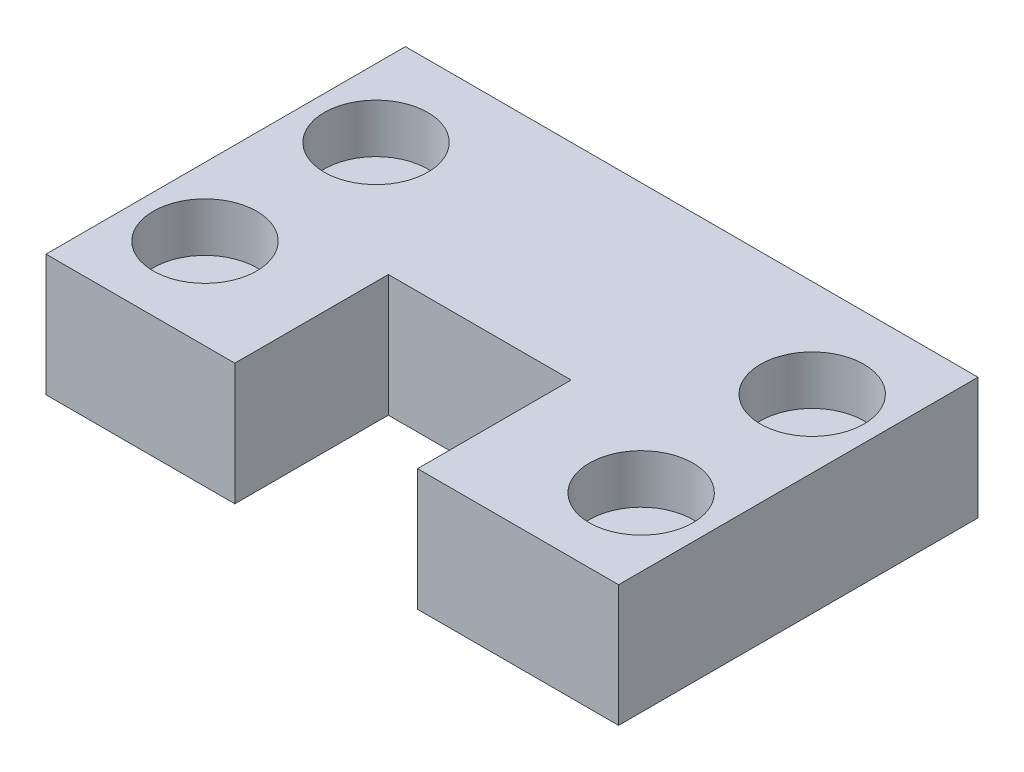
ISO-10303-21;
HEADER;
FILE_DESCRIPTION(('STEP AP214'),'2;1');
FILE_NAME('part.step','',(''),(''),'','','');
FILE_SCHEMA(('AUTOMOTIVE_DESIGN { 1 0 10303 214 1 1 1 1 }'));
ENDSEC;
DATA;
#1=APPLICATION_CONTEXT('core data for automotive mechanical design processes');
#2=APPLICATION_PROTOCOL_DEFINITION('international standard','automotive_design',2000,#1);
#3=PRODUCT_CONTEXT('',#1,'mechanical');
#4=PRODUCT('Part','Part','',(#3));
#5=PRODUCT_RELATED_PRODUCT_CATEGORY('part','',(#4));
#6=PRODUCT_DEFINITION_FORMATION('','',#4);
#7=PRODUCT_DEFINITION_CONTEXT('part definition',#1,'design');
#8=PRODUCT_DEFINITION('design','',#6,#7);
#9=PRODUCT_DEFINITION_SHAPE('','',#8);
#10=(LENGTH_UNIT() NAMED_UNIT(*) SI_UNIT(.MILLI.,.METRE.));
#11=(NAMED_UNIT(*) PLANE_ANGLE_UNIT() SI_UNIT($,.RADIAN.));
#12=(NAMED_UNIT(*) SI_UNIT($,.STERADIAN.) SOLID_ANGLE_UNIT());
#13=UNCERTAINTY_MEASURE_WITH_UNIT(LENGTH_MEASURE(1.E-05),#10,'distance_accuracy_value','');
#14=(GEOMETRIC_REPRESENTATION_CONTEXT(3) GLOBAL_UNCERTAINTY_ASSIGNED_CONTEXT((#13)) GLOBAL_UNIT_ASSIGNED_CONTEXT((#10,
#11,#12)) REPRESENTATION_CONTEXT('',''));
#15=CARTESIAN_POINT('',(0.,0.,0.));
#16=DIRECTION('',(0.,0.,1.));
#17=DIRECTION('',(1.,0.,0.));
#18=AXIS2_PLACEMENT_3D('',#15,#16,#17);
#19=CARTESIAN_POINT('',(30.5,10.,-12.6));
#20=DIRECTION('',(0.,0.,1.));
#21=DIRECTION('',(1.,0.,0.));
#22=AXIS2_PLACEMENT_3D('',#19,#20,#21);
#23=PLANE('',#22);
#24=DIRECTION('',(-1.,0.,0.));
#25=VECTOR('',#24,1.);
#26=CARTESIAN_POINT('',(30.5,0.,-12.6));
#27=LINE('',#26,#25);
#28=CARTESIAN_POINT('',(30.5,0.,-12.6));
#29=VERTEX_POINT('',#28);
#30=CARTESIAN_POINT('',(15.5,0.,-12.6));
#31=VERTEX_POINT('',#30);
#32=EDGE_CURVE('E131',#29,#31,#27,.T.);
#33=ORIENTED_EDGE('',*,*,#32,.F.);
#34=DIRECTION('',(0.,-1.,0.));
#35=VECTOR('',#34,1.);
#36=CARTESIAN_POINT('',(30.5,10.,-12.6));
#37=LINE('',#36,#35);
#38=CARTESIAN_POINT('',(30.5,10.,-12.6));
#39=VERTEX_POINT('',#38);
#40=EDGE_CURVE('E11',#39,#29,#37,.T.);
#41=ORIENTED_EDGE('',*,*,#40,.F.);
#42=DIRECTION('',(-1.,0.,0.));
#43=VECTOR('',#42,1.);
#44=CARTESIAN_POINT('',(30.5,10.,-12.6));
#45=LINE('',#44,#43);
#46=CARTESIAN_POINT('',(15.5,10.,-12.6));
#47=VERTEX_POINT('',#46);
#48=EDGE_CURVE('E151',#39,#47,#45,.T.);
#49=ORIENTED_EDGE('',*,*,#48,.T.);
#50=DIRECTION('',(0.,-1.,0.));
#51=VECTOR('',#50,1.);
#52=CARTESIAN_POINT('',(15.5,10.,-12.6));
#53=LINE('',#52,#51);
#54=EDGE_CURVE('E36',#47,#31,#53,.T.);
#55=ORIENTED_EDGE('',*,*,#54,.T.);
#56=EDGE_LOOP('',(#33,#41,#49,#55));
#57=FACE_BOUND('',#56,.T.);
#58=ADVANCED_FACE('F33',(#57),#23,.T.);
#59=CARTESIAN_POINT('',(30.5,10.,-12.6));
#60=DIRECTION('',(1.,0.,0.));
#61=DIRECTION('',(0.,0.,-1.));
#62=AXIS2_PLACEMENT_3D('',#59,#60,#61);
#63=PLANE('',#62);
#64=DIRECTION('',(0.,0.,1.));
#65=VECTOR('',#64,1.);
#66=CARTESIAN_POINT('',(30.5,0.,-12.6));
#67=LINE('',#66,#65);
#68=CARTESIAN_POINT('',(30.5,0.,0.));
#69=VERTEX_POINT('',#68);
#70=EDGE_CURVE('E150',#29,#69,#67,.T.);
#71=ORIENTED_EDGE('',*,*,#70,.T.);
#72=DIRECTION('',(0.,-1.,0.));
#73=VECTOR('',#72,1.);
#74=CARTESIAN_POINT('',(30.5,10.,0.));
#75=LINE('',#74,#73);
#76=CARTESIAN_POINT('',(30.5,10.,0.));
#77=VERTEX_POINT('',#76);
#78=EDGE_CURVE('E42',#77,#69,#75,.T.);
#79=ORIENTED_EDGE('',*,*,#78,.F.);
#80=DIRECTION('',(0.,0.,1.));
#81=VECTOR('',#80,1.);
#82=CARTESIAN_POINT('',(30.5,10.,-12.6));
#83=LINE('',#82,#81);
#84=EDGE_CURVE('E121',#39,#77,#83,.T.);
#85=ORIENTED_EDGE('',*,*,#84,.F.);
#86=ORIENTED_EDGE('',*,*,#40,.T.);
#87=EDGE_LOOP('',(#71,#79,#85,#86));
#88=FACE_BOUND('',#87,.T.);
#89=ADVANCED_FACE('F163',(#88),#63,.F.);
#90=CARTESIAN_POINT('',(47.,10.,0.));
#91=DIRECTION('',(0.,0.,1.));
#92=DIRECTION('',(1.,0.,0.));
#93=AXIS2_PLACEMENT_3D('',#90,#91,#92);
#94=PLANE('',#93);
#95=DIRECTION('',(-1.,0.,0.));
#96=VECTOR('',#95,1.);
#97=CARTESIAN_POINT('',(47.,0.,0.));
#98=LINE('',#97,#96);
#99=CARTESIAN_POINT('',(47.,0.,0.));
#100=VERTEX_POINT('',#99);
#101=EDGE_CURVE('E107',#100,#69,#98,.T.);
#102=ORIENTED_EDGE('',*,*,#101,.F.);
#103=DIRECTION('',(0.,-1.,0.));
#104=VECTOR('',#103,1.);
#105=CARTESIAN_POINT('',(47.,10.,0.));
#106=LINE('',#105,#104);
#107=CARTESIAN_POINT('',(47.,10.,0.));
#108=VERTEX_POINT('',#107);
#109=EDGE_CURVE('E102',#108,#100,#106,.T.);
#110=ORIENTED_EDGE('',*,*,#109,.F.);
#111=DIRECTION('',(-1.,0.,0.));
#112=VECTOR('',#111,1.);
#113=CARTESIAN_POINT('',(47.,10.,0.));
#114=LINE('',#113,#112);
#115=EDGE_CURVE('E105',#108,#77,#114,.T.);
#116=ORIENTED_EDGE('',*,*,#115,.T.);
#117=ORIENTED_EDGE('',*,*,#78,.T.);
#118=EDGE_LOOP('',(#102,#110,#116,#117));
#119=FACE_BOUND('',#118,.T.);
#120=ADVANCED_FACE('F104',(#119),#94,.T.);
#121=CARTESIAN_POINT('',(47.,10.,-29.5));
#122=DIRECTION('',(1.,0.,0.));
#123=DIRECTION('',(0.,0.,-1.));
#124=AXIS2_PLACEMENT_3D('',#121,#122,#123);
#125=PLANE('',#124);
#126=DIRECTION('',(0.,0.,1.));
#127=VECTOR('',#126,1.);
#128=CARTESIAN_POINT('',(47.,0.,-29.5));
#129=LINE('',#128,#127);
#130=CARTESIAN_POINT('',(47.,0.,-29.5));
#131=VERTEX_POINT('',#130);
#132=EDGE_CURVE('E147',#131,#100,#129,.T.);
#133=ORIENTED_EDGE('',*,*,#132,.F.);
#134=DIRECTION('',(0.,-1.,0.));
#135=VECTOR('',#134,1.);
#136=CARTESIAN_POINT('',(47.,10.,-29.5));
#137=LINE('',#136,#135);
#138=CARTESIAN_POINT('',(47.,10.,-29.5));
#139=VERTEX_POINT('',#138);
#140=EDGE_CURVE('E112',#139,#131,#137,.T.);
#141=ORIENTED_EDGE('',*,*,#140,.F.);
#142=DIRECTION('',(0.,0.,1.));
#143=VECTOR('',#142,1.);
#144=CARTESIAN_POINT('',(47.,10.,-29.5));
#145=LINE('',#144,#143);
#146=EDGE_CURVE('E119',#139,#108,#145,.T.);
#147=ORIENTED_EDGE('',*,*,#146,.T.);
#148=ORIENTED_EDGE('',*,*,#109,.T.);
#149=EDGE_LOOP('',(#133,#141,#147,#148));
#150=FACE_BOUND('',#149,.T.);
#151=ADVANCED_FACE('F123',(#150),#125,.T.);
#152=CARTESIAN_POINT('',(0.,10.,-29.5));
#153=DIRECTION('',(0.,0.,-1.));
#154=DIRECTION('',(-1.,0.,0.));
#155=AXIS2_PLACEMENT_3D('',#152,#153,#154);
#156=PLANE('',#155);
#157=DIRECTION('',(1.,0.,0.));
#158=VECTOR('',#157,1.);
#159=CARTESIAN_POINT('',(0.,0.,-29.5));
#160=LINE('',#159,#158);
#161=CARTESIAN_POINT('',(0.,0.,-29.5));
#162=VERTEX_POINT('',#161);
#163=EDGE_CURVE('E144',#162,#131,#160,.T.);
#164=ORIENTED_EDGE('',*,*,#163,.F.);
#165=DIRECTION('',(0.,-1.,0.));
#166=VECTOR('',#165,1.);
#167=CARTESIAN_POINT('',(0.,10.,-29.5));
#168=LINE('',#167,#166);
#169=CARTESIAN_POINT('',(0.,10.,-29.5));
#170=VERTEX_POINT('',#169);
#171=EDGE_CURVE('E155',#170,#162,#168,.T.);
#172=ORIENTED_EDGE('',*,*,#171,.F.);
#173=DIRECTION('',(1.,0.,0.));
#174=VECTOR('',#173,1.);
#175=CARTESIAN_POINT('',(0.,10.,-29.5));
#176=LINE('',#175,#174);
#177=EDGE_CURVE('E124',#170,#139,#176,.T.);
#178=ORIENTED_EDGE('',*,*,#177,.T.);
#179=ORIENTED_EDGE('',*,*,#140,.T.);
#180=EDGE_LOOP('',(#164,#172,#178,#179));
#181=FACE_BOUND('',#180,.T.);
#182=ADVANCED_FACE('F183',(#181),#156,.T.);
#183=CARTESIAN_POINT('',(0.,10.,0.));
#184=DIRECTION('',(-1.,0.,0.));
#185=DIRECTION('',(0.,0.,1.));
#186=AXIS2_PLACEMENT_3D('',#183,#184,#185);
#187=PLANE('',#186);
#188=DIRECTION('',(0.,0.,-1.));
#189=VECTOR('',#188,1.);
#190=CARTESIAN_POINT('',(0.,0.,0.));
#191=LINE('',#190,#189);
#192=CARTESIAN_POINT('',(0.,0.,0.));
#193=VERTEX_POINT('',#192);
#194=EDGE_CURVE('E141',#193,#162,#191,.T.);
#195=ORIENTED_EDGE('',*,*,#194,.F.);
#196=DIRECTION('',(0.,-1.,0.));
#197=VECTOR('',#196,1.);
#198=CARTESIAN_POINT('',(0.,10.,0.));
#199=LINE('',#198,#197);
#200=CARTESIAN_POINT('',(0.,10.,0.));
#201=VERTEX_POINT('',#200);
#202=EDGE_CURVE('E157',#201,#193,#199,.T.);
#203=ORIENTED_EDGE('',*,*,#202,.F.);
#204=DIRECTION('',(0.,0.,-1.));
#205=VECTOR('',#204,1.);
#206=CARTESIAN_POINT('',(0.,10.,0.));
#207=LINE('',#206,#205);
#208=EDGE_CURVE('E126',#201,#170,#207,.T.);
#209=ORIENTED_EDGE('',*,*,#208,.T.);
#210=ORIENTED_EDGE('',*,*,#171,.T.);
#211=EDGE_LOOP('',(#195,#203,#209,#210));
#212=FACE_BOUND('',#211,.T.);
#213=ADVANCED_FACE('F178',(#212),#187,.T.);
#214=CARTESIAN_POINT('',(15.5,10.,0.));
#215=DIRECTION('',(0.,0.,1.));
#216=DIRECTION('',(1.,0.,0.));
#217=AXIS2_PLACEMENT_3D('',#214,#215,#216);
#218=PLANE('',#217);
#219=DIRECTION('',(-1.,0.,0.));
#220=VECTOR('',#219,1.);
#221=CARTESIAN_POINT('',(15.5,0.,0.));
#222=LINE('',#221,#220);
#223=CARTESIAN_POINT('',(15.5,0.,0.));
#224=VERTEX_POINT('',#223);
#225=EDGE_CURVE('E138',#224,#193,#222,.T.);
#226=ORIENTED_EDGE('',*,*,#225,.F.);
#227=DIRECTION('',(0.,-1.,0.));
#228=VECTOR('',#227,1.);
#229=CARTESIAN_POINT('',(15.5,10.,0.));
#230=LINE('',#229,#228);
#231=CARTESIAN_POINT('',(15.5,10.,0.));
#232=VERTEX_POINT('',#231);
#233=EDGE_CURVE('E158',#232,#224,#230,.T.);
#234=ORIENTED_EDGE('',*,*,#233,.F.);
#235=DIRECTION('',(-1.,0.,0.));
#236=VECTOR('',#235,1.);
#237=CARTESIAN_POINT('',(15.5,10.,0.));
#238=LINE('',#237,#236);
#239=EDGE_CURVE('E167',#232,#201,#238,.T.);
#240=ORIENTED_EDGE('',*,*,#239,.T.);
#241=ORIENTED_EDGE('',*,*,#202,.T.);
#242=EDGE_LOOP('',(#226,#234,#240,#241));
#243=FACE_BOUND('',#242,.T.);
#244=ADVANCED_FACE('F181',(#243),#218,.T.);
#245=CARTESIAN_POINT('',(15.5,10.,-12.6));
#246=DIRECTION('',(1.,0.,0.));
#247=DIRECTION('',(0.,0.,-1.));
#248=AXIS2_PLACEMENT_3D('',#245,#246,#247);
#249=PLANE('',#248);
#250=DIRECTION('',(0.,0.,1.));
#251=VECTOR('',#250,1.);
#252=CARTESIAN_POINT('',(15.5,0.,-12.6));
#253=LINE('',#252,#251);
#254=EDGE_CURVE('E134',#31,#224,#253,.T.);
#255=ORIENTED_EDGE('',*,*,#254,.F.);
#256=ORIENTED_EDGE('',*,*,#54,.F.);
#257=DIRECTION('',(0.,0.,1.));
#258=VECTOR('',#257,1.);
#259=CARTESIAN_POINT('',(15.5,10.,-12.6));
#260=LINE('',#259,#258);
#261=EDGE_CURVE('E165',#47,#232,#260,.T.);
#262=ORIENTED_EDGE('',*,*,#261,.T.);
#263=ORIENTED_EDGE('',*,*,#233,.T.);
#264=EDGE_LOOP('',(#255,#256,#262,#263));
#265=FACE_BOUND('',#264,.T.);
#266=ADVANCED_FACE('F160',(#265),#249,.T.);
#267=CARTESIAN_POINT('',(0.,10.,0.));
#268=DIRECTION('',(0.,1.,0.));
#269=DIRECTION('',(0.,0.,1.));
#270=AXIS2_PLACEMENT_3D('',#267,#268,#269);
#271=PLANE('',#270);
#272=CARTESIAN_POINT('',(41.4,10.,-7.45));
#273=DIRECTION('',(0.,1.,0.));
#274=DIRECTION('',(0.,0.,1.));
#275=AXIS2_PLACEMENT_3D('',#272,#273,#274);
#276=CIRCLE('',#275,4.25000000000001);
#277=CARTESIAN_POINT('',(41.4,10.,-3.19999999999999));
#278=VERTEX_POINT('',#277);
#279=EDGE_CURVE('E295',#278,#278,#276,.T.);
#280=ORIENTED_EDGE('',*,*,#279,.F.);
#281=EDGE_LOOP('',(#280));
#282=FACE_BOUND('',#281,.T.);
#283=CARTESIAN_POINT('',(5.60000000000001,10.,-21.49));
#284=DIRECTION('',(0.,1.,0.));
#285=DIRECTION('',(0.,0.,1.));
#286=AXIS2_PLACEMENT_3D('',#283,#284,#285);
#287=CIRCLE('',#286,4.25);
#288=CARTESIAN_POINT('',(5.60000000000001,10.,-17.24));
#289=VERTEX_POINT('',#288);
#290=EDGE_CURVE('E289',#289,#289,#287,.T.);
#291=ORIENTED_EDGE('',*,*,#290,.F.);
#292=EDGE_LOOP('',(#291));
#293=FACE_BOUND('',#292,.T.);
#294=CARTESIAN_POINT('',(41.4,10.,-21.49));
#295=DIRECTION('',(0.,1.,0.));
#296=DIRECTION('',(0.,0.,-1.));
#297=AXIS2_PLACEMENT_3D('',#294,#295,#296);
#298=CIRCLE('',#297,4.25);
#299=CARTESIAN_POINT('',(41.4,10.,-25.74));
#300=VERTEX_POINT('',#299);
#301=EDGE_CURVE('E283',#300,#300,#298,.T.);
#302=ORIENTED_EDGE('',*,*,#301,.F.);
#303=EDGE_LOOP('',(#302));
#304=FACE_BOUND('',#303,.T.);
#305=CARTESIAN_POINT('',(5.60000000000001,10.,-7.45));
#306=DIRECTION('',(0.,1.,0.));
#307=DIRECTION('',(0.,0.,-1.));
#308=AXIS2_PLACEMENT_3D('',#305,#306,#307);
#309=CIRCLE('',#308,4.25000000000001);
#310=CARTESIAN_POINT('',(5.60000000000001,10.,-11.7));
#311=VERTEX_POINT('',#310);
#312=EDGE_CURVE('E170',#311,#311,#309,.T.);
#313=ORIENTED_EDGE('',*,*,#312,.F.);
#314=EDGE_LOOP('',(#313));
#315=FACE_BOUND('',#314,.T.);
#316=ORIENTED_EDGE('',*,*,#48,.F.);
#317=ORIENTED_EDGE('',*,*,#84,.T.);
#318=ORIENTED_EDGE('',*,*,#115,.F.);
#319=ORIENTED_EDGE('',*,*,#146,.F.);
#320=ORIENTED_EDGE('',*,*,#177,.F.);
#321=ORIENTED_EDGE('',*,*,#208,.F.);
#322=ORIENTED_EDGE('',*,*,#239,.F.);
#323=ORIENTED_EDGE('',*,*,#261,.F.);
#324=EDGE_LOOP('',(#316,#317,#318,#319,#320,#321,#322,#323));
#325=FACE_BOUND('',#324,.T.);
#326=ADVANCED_FACE('F117',(#282,#293,#304,#315,#325),#271,.T.);
#327=CARTESIAN_POINT('',(0.,0.,0.));
#328=DIRECTION('',(0.,1.,0.));
#329=DIRECTION('',(0.,0.,1.));
#330=AXIS2_PLACEMENT_3D('',#327,#328,#329);
#331=PLANE('',#330);
#332=CARTESIAN_POINT('',(41.4,0.,-7.45));
#333=DIRECTION('',(0.,1.,0.));
#334=DIRECTION('',(0.,0.,-1.));
#335=AXIS2_PLACEMENT_3D('',#332,#333,#334);
#336=CIRCLE('',#335,1.3);
#337=CARTESIAN_POINT('',(41.4,0.,-6.15));
#338=VERTEX_POINT('',#337);
#339=EDGE_CURVE('E268',#338,#338,#336,.T.);
#340=ORIENTED_EDGE('',*,*,#339,.T.);
#341=EDGE_LOOP('',(#340));
#342=FACE_BOUND('',#341,.T.);
#343=CARTESIAN_POINT('',(5.60000000000001,0.,-21.49));
#344=DIRECTION('',(0.,1.,0.));
#345=DIRECTION('',(0.,0.,1.));
#346=AXIS2_PLACEMENT_3D('',#343,#344,#345);
#347=CIRCLE('',#346,1.3);
#348=CARTESIAN_POINT('',(5.60000000000001,0.,-20.19));
#349=VERTEX_POINT('',#348);
#350=EDGE_CURVE('E275',#349,#349,#347,.T.);
#351=ORIENTED_EDGE('',*,*,#350,.T.);
#352=EDGE_LOOP('',(#351));
#353=FACE_BOUND('',#352,.T.);
#354=CARTESIAN_POINT('',(41.4,0.,-21.49));
#355=DIRECTION('',(0.,1.,0.));
#356=DIRECTION('',(0.,0.,1.));
#357=AXIS2_PLACEMENT_3D('',#354,#355,#356);
#358=CIRCLE('',#357,1.3);
#359=CARTESIAN_POINT('',(41.4,0.,-20.19));
#360=VERTEX_POINT('',#359);
#361=EDGE_CURVE('E260',#360,#360,#358,.T.);
#362=ORIENTED_EDGE('',*,*,#361,.T.);
#363=EDGE_LOOP('',(#362));
#364=FACE_BOUND('',#363,.T.);
#365=CARTESIAN_POINT('',(5.60000000000001,0.,-7.45));
#366=DIRECTION('',(0.,1.,0.));
#367=DIRECTION('',(0.,0.,1.));
#368=AXIS2_PLACEMENT_3D('',#365,#366,#367);
#369=CIRCLE('',#368,1.3);
#370=CARTESIAN_POINT('',(5.60000000000001,0.,-6.15));
#371=VERTEX_POINT('',#370);
#372=EDGE_CURVE('E280',#371,#371,#369,.T.);
#373=ORIENTED_EDGE('',*,*,#372,.T.);
#374=EDGE_LOOP('',(#373));
#375=FACE_BOUND('',#374,.T.);
#376=ORIENTED_EDGE('',*,*,#32,.T.);
#377=ORIENTED_EDGE('',*,*,#254,.T.);
#378=ORIENTED_EDGE('',*,*,#225,.T.);
#379=ORIENTED_EDGE('',*,*,#194,.T.);
#380=ORIENTED_EDGE('',*,*,#163,.T.);
#381=ORIENTED_EDGE('',*,*,#132,.T.);
#382=ORIENTED_EDGE('',*,*,#101,.T.);
#383=ORIENTED_EDGE('',*,*,#70,.F.);
#384=EDGE_LOOP('',(#376,#377,#378,#379,#380,#381,#382,#383));
#385=FACE_BOUND('',#384,.T.);
#386=ADVANCED_FACE('F162',(#342,#353,#364,#375,#385),#331,.F.);
#387=CARTESIAN_POINT('',(5.60000000000001,5.98,-7.45));
#388=DIRECTION('',(0.,1.,0.));
#389=DIRECTION('',(0.,0.,1.));
#390=AXIS2_PLACEMENT_3D('',#387,#388,#389);
#391=CYLINDRICAL_SURFACE('',#390,4.25000000000001);
#392=CARTESIAN_POINT('',(5.60000000000001,5.98,-7.45));
#393=DIRECTION('',(0.,1.,0.));
#394=DIRECTION('',(0.,0.,-1.));
#395=AXIS2_PLACEMENT_3D('',#392,#393,#394);
#396=CIRCLE('',#395,4.25000000000001);
#397=CARTESIAN_POINT('',(5.60000000000001,5.98,-11.7));
#398=VERTEX_POINT('',#397);
#399=EDGE_CURVE('E135',#398,#398,#396,.T.);
#400=ORIENTED_EDGE('',*,*,#399,.F.);
#401=EDGE_LOOP('',(#400));
#402=FACE_BOUND('',#401,.T.);
#403=ORIENTED_EDGE('',*,*,#312,.T.);
#404=EDGE_LOOP('',(#403));
#405=FACE_BOUND('',#404,.T.);
#406=ADVANCED_FACE('F204',(#402,#405),#391,.F.);
#407=CARTESIAN_POINT('',(5.60000000000001,5.98,-7.45));
#408=DIRECTION('',(0.,-1.,0.));
#409=DIRECTION('',(0.,0.,-1.));
#410=AXIS2_PLACEMENT_3D('',#407,#408,#409);
#411=PLANE('',#410);
#412=CARTESIAN_POINT('',(5.60000000000001,5.98,-7.45));
#413=DIRECTION('',(0.,1.,0.));
#414=DIRECTION('',(0.,0.,1.));
#415=AXIS2_PLACEMENT_3D('',#412,#413,#414);
#416=CIRCLE('',#415,1.3);
#417=CARTESIAN_POINT('',(5.60000000000001,5.98,-6.15));
#418=VERTEX_POINT('',#417);
#419=EDGE_CURVE('E271',#418,#418,#416,.T.);
#420=ORIENTED_EDGE('',*,*,#419,.F.);
#421=EDGE_LOOP('',(#420));
#422=FACE_BOUND('',#421,.T.);
#423=ORIENTED_EDGE('',*,*,#399,.T.);
#424=EDGE_LOOP('',(#423));
#425=FACE_BOUND('',#424,.T.);
#426=ADVANCED_FACE('F211',(#422,#425),#411,.F.);
#427=CARTESIAN_POINT('',(41.4,5.98,-21.49));
#428=DIRECTION('',(0.,1.,0.));
#429=DIRECTION('',(0.,0.,1.));
#430=AXIS2_PLACEMENT_3D('',#427,#428,#429);
#431=CYLINDRICAL_SURFACE('',#430,4.25);
#432=CARTESIAN_POINT('',(41.4,5.98,-21.49));
#433=DIRECTION('',(0.,1.,0.));
#434=DIRECTION('',(0.,0.,-1.));
#435=AXIS2_PLACEMENT_3D('',#432,#433,#434);
#436=CIRCLE('',#435,4.25);
#437=CARTESIAN_POINT('',(41.4,5.98,-25.74));
#438=VERTEX_POINT('',#437);
#439=EDGE_CURVE('E286',#438,#438,#436,.T.);
#440=ORIENTED_EDGE('',*,*,#439,.F.);
#441=EDGE_LOOP('',(#440));
#442=FACE_BOUND('',#441,.T.);
#443=ORIENTED_EDGE('',*,*,#301,.T.);
#444=EDGE_LOOP('',(#443));
#445=FACE_BOUND('',#444,.T.);
#446=ADVANCED_FACE('F215',(#442,#445),#431,.F.);
#447=CARTESIAN_POINT('',(41.4,5.98,-21.49));
#448=DIRECTION('',(0.,-1.,0.));
#449=DIRECTION('',(0.,0.,-1.));
#450=AXIS2_PLACEMENT_3D('',#447,#448,#449);
#451=PLANE('',#450);
#452=CARTESIAN_POINT('',(41.4,5.98,-21.49));
#453=DIRECTION('',(0.,1.,0.));
#454=DIRECTION('',(0.,0.,1.));
#455=AXIS2_PLACEMENT_3D('',#452,#453,#454);
#456=CIRCLE('',#455,1.3);
#457=CARTESIAN_POINT('',(41.4,5.98,-20.19));
#458=VERTEX_POINT('',#457);
#459=EDGE_CURVE('E263',#458,#458,#456,.T.);
#460=ORIENTED_EDGE('',*,*,#459,.F.);
#461=EDGE_LOOP('',(#460));
#462=FACE_BOUND('',#461,.T.);
#463=ORIENTED_EDGE('',*,*,#439,.T.);
#464=EDGE_LOOP('',(#463));
#465=FACE_BOUND('',#464,.T.);
#466=ADVANCED_FACE('F221',(#462,#465),#451,.F.);
#467=CARTESIAN_POINT('',(5.60000000000001,5.98,-21.49));
#468=DIRECTION('',(0.,1.,0.));
#469=DIRECTION('',(0.,0.,1.));
#470=AXIS2_PLACEMENT_3D('',#467,#468,#469);
#471=CYLINDRICAL_SURFACE('',#470,4.25);
#472=CARTESIAN_POINT('',(5.60000000000001,5.98,-21.49));
#473=DIRECTION('',(0.,1.,0.));
#474=DIRECTION('',(0.,0.,1.));
#475=AXIS2_PLACEMENT_3D('',#472,#473,#474);
#476=CIRCLE('',#475,4.25);
#477=CARTESIAN_POINT('',(5.60000000000001,5.98,-17.24));
#478=VERTEX_POINT('',#477);
#479=EDGE_CURVE('E298',#478,#478,#476,.T.);
#480=ORIENTED_EDGE('',*,*,#479,.F.);
#481=EDGE_LOOP('',(#480));
#482=FACE_BOUND('',#481,.T.);
#483=ORIENTED_EDGE('',*,*,#290,.T.);
#484=EDGE_LOOP('',(#483));
#485=FACE_BOUND('',#484,.T.);
#486=ADVANCED_FACE('F217',(#482,#485),#471,.F.);
#487=CARTESIAN_POINT('',(5.60000000000001,5.98,-21.49));
#488=DIRECTION('',(0.,1.,0.));
#489=DIRECTION('',(0.,0.,1.));
#490=AXIS2_PLACEMENT_3D('',#487,#488,#489);
#491=PLANE('',#490);
#492=CARTESIAN_POINT('',(5.60000000000001,5.98,-21.49));
#493=DIRECTION('',(0.,1.,0.));
#494=DIRECTION('',(0.,0.,1.));
#495=AXIS2_PLACEMENT_3D('',#492,#493,#494);
#496=CIRCLE('',#495,1.3);
#497=CARTESIAN_POINT('',(5.60000000000001,5.98,-20.19));
#498=VERTEX_POINT('',#497);
#499=EDGE_CURVE('E265',#498,#498,#496,.T.);
#500=ORIENTED_EDGE('',*,*,#499,.F.);
#501=EDGE_LOOP('',(#500));
#502=FACE_BOUND('',#501,.T.);
#503=ORIENTED_EDGE('',*,*,#479,.T.);
#504=EDGE_LOOP('',(#503));
#505=FACE_BOUND('',#504,.T.);
#506=ADVANCED_FACE('F220',(#502,#505),#491,.T.);
#507=CARTESIAN_POINT('',(41.4,5.98,-7.45));
#508=DIRECTION('',(0.,1.,0.));
#509=DIRECTION('',(0.,0.,1.));
#510=AXIS2_PLACEMENT_3D('',#507,#508,#509);
#511=CYLINDRICAL_SURFACE('',#510,4.25000000000001);
#512=CARTESIAN_POINT('',(41.4,5.98,-7.45));
#513=DIRECTION('',(0.,1.,0.));
#514=DIRECTION('',(0.,0.,1.));
#515=AXIS2_PLACEMENT_3D('',#512,#513,#514);
#516=CIRCLE('',#515,4.25000000000001);
#517=CARTESIAN_POINT('',(41.4,5.98,-3.19999999999999));
#518=VERTEX_POINT('',#517);
#519=EDGE_CURVE('E292',#518,#518,#516,.T.);
#520=ORIENTED_EDGE('',*,*,#519,.F.);
#521=EDGE_LOOP('',(#520));
#522=FACE_BOUND('',#521,.T.);
#523=ORIENTED_EDGE('',*,*,#279,.T.);
#524=EDGE_LOOP('',(#523));
#525=FACE_BOUND('',#524,.T.);
#526=ADVANCED_FACE('F225',(#522,#525),#511,.F.);
#527=CARTESIAN_POINT('',(41.4,5.98,-7.45));
#528=DIRECTION('',(0.,1.,0.));
#529=DIRECTION('',(0.,0.,1.));
#530=AXIS2_PLACEMENT_3D('',#527,#528,#529);
#531=PLANE('',#530);
#532=CARTESIAN_POINT('',(41.4,5.98,-7.45));
#533=DIRECTION('',(0.,1.,0.));
#534=DIRECTION('',(0.,0.,-1.));
#535=AXIS2_PLACEMENT_3D('',#532,#533,#534);
#536=CIRCLE('',#535,1.3);
#537=CARTESIAN_POINT('',(41.4,5.98,-6.15));
#538=VERTEX_POINT('',#537);
#539=EDGE_CURVE('E272',#538,#538,#536,.T.);
#540=ORIENTED_EDGE('',*,*,#539,.F.);
#541=EDGE_LOOP('',(#540));
#542=FACE_BOUND('',#541,.T.);
#543=ORIENTED_EDGE('',*,*,#519,.T.);
#544=EDGE_LOOP('',(#543));
#545=FACE_BOUND('',#544,.T.);
#546=ADVANCED_FACE('F229',(#542,#545),#531,.T.);
#547=CARTESIAN_POINT('',(5.60000000000001,0.,-7.45));
#548=DIRECTION('',(0.,1.,0.));
#549=DIRECTION('',(0.,0.,1.));
#550=AXIS2_PLACEMENT_3D('',#547,#548,#549);
#551=CYLINDRICAL_SURFACE('',#550,1.3);
#552=CARTESIAN_POINT('',(5.60000000000001,0.,-6.15));
#553=CARTESIAN_POINT('',(5.60000000000001,0.0622916666666666,-6.15));
#554=CARTESIAN_POINT('',(5.60000000000001,0.124583333333333,-6.15));
#555=CARTESIAN_POINT('',(5.60000000000001,0.249166666666667,-6.15));
#556=CARTESIAN_POINT('',(5.60000000000001,0.311458333333333,-6.15));
#557=CARTESIAN_POINT('',(5.60000000000001,0.436041666666667,-6.15));
#558=CARTESIAN_POINT('',(5.60000000000001,0.498333333333333,-6.15));
#559=CARTESIAN_POINT('',(5.60000000000001,0.622916666666667,-6.15));
#560=CARTESIAN_POINT('',(5.60000000000001,0.685208333333333,-6.15));
#561=CARTESIAN_POINT('',(5.60000000000001,0.809791666666667,-6.15));
#562=CARTESIAN_POINT('',(5.60000000000001,0.872083333333333,-6.15));
#563=CARTESIAN_POINT('',(5.60000000000001,0.996666666666667,-6.15));
#564=CARTESIAN_POINT('',(5.60000000000001,1.05895833333333,-6.15));
#565=CARTESIAN_POINT('',(5.60000000000001,1.18354166666667,-6.15));
#566=CARTESIAN_POINT('',(5.60000000000001,1.24583333333333,-6.15));
#567=CARTESIAN_POINT('',(5.60000000000001,1.37041666666667,-6.15));
#568=CARTESIAN_POINT('',(5.60000000000001,1.43270833333333,-6.15));
#569=CARTESIAN_POINT('',(5.60000000000001,1.55729166666667,-6.15));
#570=CARTESIAN_POINT('',(5.60000000000001,1.61958333333333,-6.15));
#571=CARTESIAN_POINT('',(5.60000000000001,1.74416666666667,-6.15));
#572=CARTESIAN_POINT('',(5.60000000000001,1.80645833333333,-6.15));
#573=CARTESIAN_POINT('',(5.60000000000001,1.93104166666667,-6.15));
#574=CARTESIAN_POINT('',(5.60000000000001,1.99333333333333,-6.15));
#575=CARTESIAN_POINT('',(5.60000000000001,2.11791666666667,-6.15));
#576=CARTESIAN_POINT('',(5.60000000000001,2.18020833333333,-6.15));
#577=CARTESIAN_POINT('',(5.60000000000001,2.30479166666667,-6.15));
#578=CARTESIAN_POINT('',(5.60000000000001,2.36708333333333,-6.15));
#579=CARTESIAN_POINT('',(5.60000000000001,2.49166666666667,-6.15));
#580=CARTESIAN_POINT('',(5.60000000000001,2.55395833333333,-6.15));
#581=CARTESIAN_POINT('',(5.60000000000001,2.67854166666667,-6.15));
#582=CARTESIAN_POINT('',(5.60000000000001,2.74083333333333,-6.15));
#583=CARTESIAN_POINT('',(5.60000000000001,2.86541666666667,-6.15));
#584=CARTESIAN_POINT('',(5.60000000000001,2.92770833333333,-6.15));
#585=CARTESIAN_POINT('',(5.60000000000001,3.05229166666667,-6.15));
#586=CARTESIAN_POINT('',(5.60000000000001,3.11458333333333,-6.15));
#587=CARTESIAN_POINT('',(5.60000000000001,3.23916666666667,-6.15));
#588=CARTESIAN_POINT('',(5.60000000000001,3.30145833333333,-6.15));
#589=CARTESIAN_POINT('',(5.60000000000001,3.42604166666667,-6.15));
#590=CARTESIAN_POINT('',(5.60000000000001,3.48833333333333,-6.15));
#591=CARTESIAN_POINT('',(5.60000000000001,3.61291666666667,-6.15));
#592=CARTESIAN_POINT('',(5.60000000000001,3.67520833333333,-6.15));
#593=CARTESIAN_POINT('',(5.60000000000001,3.79979166666667,-6.15));
#594=CARTESIAN_POINT('',(5.60000000000001,3.86208333333333,-6.15));
#595=CARTESIAN_POINT('',(5.60000000000001,3.98666666666667,-6.15));
#596=CARTESIAN_POINT('',(5.60000000000001,4.04895833333333,-6.15));
#597=CARTESIAN_POINT('',(5.60000000000001,4.17354166666667,-6.15));
#598=CARTESIAN_POINT('',(5.60000000000001,4.23583333333333,-6.15));
#599=CARTESIAN_POINT('',(5.60000000000001,4.36041666666667,-6.15));
#600=CARTESIAN_POINT('',(5.60000000000001,4.42270833333333,-6.15));
#601=CARTESIAN_POINT('',(5.60000000000001,4.54729166666667,-6.15));
#602=CARTESIAN_POINT('',(5.60000000000001,4.60958333333333,-6.15));
#603=CARTESIAN_POINT('',(5.60000000000001,4.73416666666667,-6.15));
#604=CARTESIAN_POINT('',(5.60000000000001,4.79645833333333,-6.15));
#605=CARTESIAN_POINT('',(5.60000000000001,4.92104166666667,-6.15));
#606=CARTESIAN_POINT('',(5.60000000000001,4.98333333333333,-6.15));
#607=CARTESIAN_POINT('',(5.60000000000001,5.10791666666667,-6.15));
#608=CARTESIAN_POINT('',(5.60000000000001,5.17020833333333,-6.15));
#609=CARTESIAN_POINT('',(5.60000000000001,5.29479166666667,-6.15));
#610=CARTESIAN_POINT('',(5.60000000000001,5.35708333333333,-6.15));
#611=CARTESIAN_POINT('',(5.60000000000001,5.48166666666667,-6.15));
#612=CARTESIAN_POINT('',(5.60000000000001,5.54395833333333,-6.15));
#613=CARTESIAN_POINT('',(5.60000000000001,5.66854166666667,-6.15));
#614=CARTESIAN_POINT('',(5.60000000000001,5.73083333333333,-6.15));
#615=CARTESIAN_POINT('',(5.60000000000001,5.85541666666667,-6.15));
#616=CARTESIAN_POINT('',(5.60000000000001,5.91770833333333,-6.15));
#617=CARTESIAN_POINT('',(5.60000000000001,5.98,-6.15));
#618=B_SPLINE_CURVE_WITH_KNOTS('',3,(#552,#553,#554,#555,#556,#557,#558,#559,#560,#561,#562,
#563,#564,#565,#566,#567,#568,#569,#570,#571,#572,#573,#574,#575,#576,#577,#578,#579,#580,#581,
#582,#583,#584,#585,#586,#587,#588,#589,#590,#591,#592,#593,#594,#595,#596,#597,#598,#599,#600,
#601,#602,#603,#604,#605,#606,#607,#608,#609,#610,#611,#612,#613,#614,#615,#616,#617),
.UNSPECIFIED.,.F.,.F.,(4,2,2,2,2,2,2,2,2,2,2,2,2,2,2,2,2,2,2,2,2,2,2,2,2,2,2,2,2,2,2,2,4),(0.,
0.186875,0.37375,0.560625,0.7475,0.934375,1.12125,1.308125,1.495,1.681875,1.86875,2.055625,
2.2425,2.429375,2.61625,2.803125,2.99,3.176875,3.36375,3.550625,3.7375,3.924375,4.11125,
4.298125,4.485,4.671875,4.85875,5.045625,5.2325,5.419375,5.60625,5.793125,5.98),.UNSPECIFIED.);
#619=EDGE_CURVE('BSEAM233',#371,#418,#618,.T.);
#620=ORIENTED_EDGE('',*,*,#372,.F.);
#621=ORIENTED_EDGE('',*,*,#419,.T.);
#622=ORIENTED_EDGE('',*,*,#619,.T.);
#623=ORIENTED_EDGE('',*,*,#619,.F.);
#624=EDGE_LOOP('',(#620,#622,#621,#623));
#625=FACE_BOUND('',#624,.T.);
#626=ADVANCED_FACE('F233',(#625),#551,.F.);
#627=CARTESIAN_POINT('',(41.4,0.,-21.49));
#628=DIRECTION('',(0.,1.,0.));
#629=DIRECTION('',(0.,0.,1.));
#630=AXIS2_PLACEMENT_3D('',#627,#628,#629);
#631=CYLINDRICAL_SURFACE('',#630,1.3);
#632=CARTESIAN_POINT('',(41.4,0.,-20.19));
#633=CARTESIAN_POINT('',(41.4,0.0622916666666666,-20.19));
#634=CARTESIAN_POINT('',(41.4,0.124583333333333,-20.19));
#635=CARTESIAN_POINT('',(41.4,0.249166666666667,-20.19));
#636=CARTESIAN_POINT('',(41.4,0.311458333333333,-20.19));
#637=CARTESIAN_POINT('',(41.4,0.436041666666667,-20.19));
#638=CARTESIAN_POINT('',(41.4,0.498333333333333,-20.19));
#639=CARTESIAN_POINT('',(41.4,0.622916666666667,-20.19));
#640=CARTESIAN_POINT('',(41.4,0.685208333333333,-20.19));
#641=CARTESIAN_POINT('',(41.4,0.809791666666667,-20.19));
#642=CARTESIAN_POINT('',(41.4,0.872083333333333,-20.19));
#643=CARTESIAN_POINT('',(41.4,0.996666666666667,-20.19));
#644=CARTESIAN_POINT('',(41.4,1.05895833333333,-20.19));
#645=CARTESIAN_POINT('',(41.4,1.18354166666667,-20.19));
#646=CARTESIAN_POINT('',(41.4,1.24583333333333,-20.19));
#647=CARTESIAN_POINT('',(41.4,1.37041666666667,-20.19));
#648=CARTESIAN_POINT('',(41.4,1.43270833333333,-20.19));
#649=CARTESIAN_POINT('',(41.4,1.55729166666667,-20.19));
#650=CARTESIAN_POINT('',(41.4,1.61958333333333,-20.19));
#651=CARTESIAN_POINT('',(41.4,1.74416666666667,-20.19));
#652=CARTESIAN_POINT('',(41.4,1.80645833333333,-20.19));
#653=CARTESIAN_POINT('',(41.4,1.93104166666667,-20.19));
#654=CARTESIAN_POINT('',(41.4,1.99333333333333,-20.19));
#655=CARTESIAN_POINT('',(41.4,2.11791666666667,-20.19));
#656=CARTESIAN_POINT('',(41.4,2.18020833333333,-20.19));
#657=CARTESIAN_POINT('',(41.4,2.30479166666667,-20.19));
#658=CARTESIAN_POINT('',(41.4,2.36708333333333,-20.19));
#659=CARTESIAN_POINT('',(41.4,2.49166666666667,-20.19));
#660=CARTESIAN_POINT('',(41.4,2.55395833333333,-20.19));
#661=CARTESIAN_POINT('',(41.4,2.67854166666667,-20.19));
#662=CARTESIAN_POINT('',(41.4,2.74083333333333,-20.19));
#663=CARTESIAN_POINT('',(41.4,2.86541666666667,-20.19));
#664=CARTESIAN_POINT('',(41.4,2.92770833333333,-20.19));
#665=CARTESIAN_POINT('',(41.4,3.05229166666667,-20.19));
#666=CARTESIAN_POINT('',(41.4,3.11458333333333,-20.19));
#667=CARTESIAN_POINT('',(41.4,3.23916666666667,-20.19));
#668=CARTESIAN_POINT('',(41.4,3.30145833333333,-20.19));
#669=CARTESIAN_POINT('',(41.4,3.42604166666667,-20.19));
#670=CARTESIAN_POINT('',(41.4,3.48833333333333,-20.19));
#671=CARTESIAN_POINT('',(41.4,3.61291666666667,-20.19));
#672=CARTESIAN_POINT('',(41.4,3.67520833333333,-20.19));
#673=CARTESIAN_POINT('',(41.4,3.79979166666667,-20.19));
#674=CARTESIAN_POINT('',(41.4,3.86208333333333,-20.19));
#675=CARTESIAN_POINT('',(41.4,3.98666666666667,-20.19));
#676=CARTESIAN_POINT('',(41.4,4.04895833333333,-20.19));
#677=CARTESIAN_POINT('',(41.4,4.17354166666667,-20.19));
#678=CARTESIAN_POINT('',(41.4,4.23583333333333,-20.19));
#679=CARTESIAN_POINT('',(41.4,4.36041666666667,-20.19));
#680=CARTESIAN_POINT('',(41.4,4.42270833333333,-20.19));
#681=CARTESIAN_POINT('',(41.4,4.54729166666667,-20.19));
#682=CARTESIAN_POINT('',(41.4,4.60958333333333,-20.19));
#683=CARTESIAN_POINT('',(41.4,4.73416666666667,-20.19));
#684=CARTESIAN_POINT('',(41.4,4.79645833333333,-20.19));
#685=CARTESIAN_POINT('',(41.4,4.92104166666667,-20.19));
#686=CARTESIAN_POINT('',(41.4,4.98333333333333,-20.19));
#687=CARTESIAN_POINT('',(41.4,5.10791666666667,-20.19));
#688=CARTESIAN_POINT('',(41.4,5.17020833333333,-20.19));
#689=CARTESIAN_POINT('',(41.4,5.29479166666667,-20.19));
#690=CARTESIAN_POINT('',(41.4,5.35708333333333,-20.19));
#691=CARTESIAN_POINT('',(41.4,5.48166666666667,-20.19));
#692=CARTESIAN_POINT('',(41.4,5.54395833333333,-20.19));
#693=CARTESIAN_POINT('',(41.4,5.66854166666667,-20.19));
#694=CARTESIAN_POINT('',(41.4,5.73083333333333,-20.19));
#695=CARTESIAN_POINT('',(41.4,5.85541666666667,-20.19));
#696=CARTESIAN_POINT('',(41.4,5.91770833333333,-20.19));
#697=CARTESIAN_POINT('',(41.4,5.98,-20.19));
#698=B_SPLINE_CURVE_WITH_KNOTS('',3,(#632,#633,#634,#635,#636,#637,#638,#639,#640,#641,#642,
#643,#644,#645,#646,#647,#648,#649,#650,#651,#652,#653,#654,#655,#656,#657,#658,#659,#660,#661,
#662,#663,#664,#665,#666,#667,#668,#669,#670,#671,#672,#673,#674,#675,#676,#677,#678,#679,#680,
#681,#682,#683,#684,#685,#686,#687,#688,#689,#690,#691,#692,#693,#694,#695,#696,#697),
.UNSPECIFIED.,.F.,.F.,(4,2,2,2,2,2,2,2,2,2,2,2,2,2,2,2,2,2,2,2,2,2,2,2,2,2,2,2,2,2,2,2,4),(0.,
0.186875,0.37375,0.560625,0.7475,0.934375,1.12125,1.308125,1.495,1.681875,1.86875,2.055625,
2.2425,2.429375,2.61625,2.803125,2.99,3.176875,3.36375,3.550625,3.7375,3.924375,4.11125,
4.298125,4.485,4.671875,4.85875,5.045625,5.2325,5.419375,5.60625,5.793125,5.98),.UNSPECIFIED.);
#699=EDGE_CURVE('BSEAM243',#360,#458,#698,.T.);
#700=ORIENTED_EDGE('',*,*,#361,.F.);
#701=ORIENTED_EDGE('',*,*,#459,.T.);
#702=ORIENTED_EDGE('',*,*,#699,.T.);
#703=ORIENTED_EDGE('',*,*,#699,.F.);
#704=EDGE_LOOP('',(#700,#702,#701,#703));
#705=FACE_BOUND('',#704,.T.);
#706=ADVANCED_FACE('F243',(#705),#631,.F.);
#707=CARTESIAN_POINT('',(5.60000000000001,0.,-21.49));
#708=DIRECTION('',(0.,1.,0.));
#709=DIRECTION('',(0.,0.,1.));
#710=AXIS2_PLACEMENT_3D('',#707,#708,#709);
#711=CYLINDRICAL_SURFACE('',#710,1.3);
#712=CARTESIAN_POINT('',(5.60000000000001,0.,-20.19));
#713=CARTESIAN_POINT('',(5.60000000000001,0.0622916666666666,-20.19));
#714=CARTESIAN_POINT('',(5.60000000000001,0.124583333333333,-20.19));
#715=CARTESIAN_POINT('',(5.60000000000001,0.249166666666667,-20.19));
#716=CARTESIAN_POINT('',(5.60000000000001,0.311458333333333,-20.19));
#717=CARTESIAN_POINT('',(5.60000000000001,0.436041666666667,-20.19));
#718=CARTESIAN_POINT('',(5.60000000000001,0.498333333333333,-20.19));
#719=CARTESIAN_POINT('',(5.60000000000001,0.622916666666667,-20.19));
#720=CARTESIAN_POINT('',(5.60000000000001,0.685208333333333,-20.19));
#721=CARTESIAN_POINT('',(5.60000000000001,0.809791666666667,-20.19));
#722=CARTESIAN_POINT('',(5.60000000000001,0.872083333333333,-20.19));
#723=CARTESIAN_POINT('',(5.60000000000001,0.996666666666667,-20.19));
#724=CARTESIAN_POINT('',(5.60000000000001,1.05895833333333,-20.19));
#725=CARTESIAN_POINT('',(5.60000000000001,1.18354166666667,-20.19));
#726=CARTESIAN_POINT('',(5.60000000000001,1.24583333333333,-20.19));
#727=CARTESIAN_POINT('',(5.60000000000001,1.37041666666667,-20.19));
#728=CARTESIAN_POINT('',(5.60000000000001,1.43270833333333,-20.19));
#729=CARTESIAN_POINT('',(5.60000000000001,1.55729166666667,-20.19));
#730=CARTESIAN_POINT('',(5.60000000000001,1.61958333333333,-20.19));
#731=CARTESIAN_POINT('',(5.60000000000001,1.74416666666667,-20.19));
#732=CARTESIAN_POINT('',(5.60000000000001,1.80645833333333,-20.19));
#733=CARTESIAN_POINT('',(5.60000000000001,1.93104166666667,-20.19));
#734=CARTESIAN_POINT('',(5.60000000000001,1.99333333333333,-20.19));
#735=CARTESIAN_POINT('',(5.60000000000001,2.11791666666667,-20.19));
#736=CARTESIAN_POINT('',(5.60000000000001,2.18020833333333,-20.19));
#737=CARTESIAN_POINT('',(5.60000000000001,2.30479166666667,-20.19));
#738=CARTESIAN_POINT('',(5.60000000000001,2.36708333333333,-20.19));
#739=CARTESIAN_POINT('',(5.60000000000001,2.49166666666667,-20.19));
#740=CARTESIAN_POINT('',(5.60000000000001,2.55395833333333,-20.19));
#741=CARTESIAN_POINT('',(5.60000000000001,2.67854166666667,-20.19));
#742=CARTESIAN_POINT('',(5.60000000000001,2.74083333333333,-20.19));
#743=CARTESIAN_POINT('',(5.60000000000001,2.86541666666667,-20.19));
#744=CARTESIAN_POINT('',(5.60000000000001,2.92770833333333,-20.19));
#745=CARTESIAN_POINT('',(5.60000000000001,3.05229166666667,-20.19));
#746=CARTESIAN_POINT('',(5.60000000000001,3.11458333333333,-20.19));
#747=CARTESIAN_POINT('',(5.60000000000001,3.23916666666667,-20.19));
#748=CARTESIAN_POINT('',(5.60000000000001,3.30145833333333,-20.19));
#749=CARTESIAN_POINT('',(5.60000000000001,3.42604166666667,-20.19));
#750=CARTESIAN_POINT('',(5.60000000000001,3.48833333333333,-20.19));
#751=CARTESIAN_POINT('',(5.60000000000001,3.61291666666667,-20.19));
#752=CARTESIAN_POINT('',(5.60000000000001,3.67520833333333,-20.19));
#753=CARTESIAN_POINT('',(5.60000000000001,3.79979166666667,-20.19));
#754=CARTESIAN_POINT('',(5.60000000000001,3.86208333333333,-20.19));
#755=CARTESIAN_POINT('',(5.60000000000001,3.98666666666667,-20.19));
#756=CARTESIAN_POINT('',(5.60000000000001,4.04895833333333,-20.19));
#757=CARTESIAN_POINT('',(5.60000000000001,4.17354166666667,-20.19));
#758=CARTESIAN_POINT('',(5.60000000000001,4.23583333333333,-20.19));
#759=CARTESIAN_POINT('',(5.60000000000001,4.36041666666667,-20.19));
#760=CARTESIAN_POINT('',(5.60000000000001,4.42270833333333,-20.19));
#761=CARTESIAN_POINT('',(5.60000000000001,4.54729166666667,-20.19));
#762=CARTESIAN_POINT('',(5.60000000000001,4.60958333333333,-20.19));
#763=CARTESIAN_POINT('',(5.60000000000001,4.73416666666667,-20.19));
#764=CARTESIAN_POINT('',(5.60000000000001,4.79645833333333,-20.19));
#765=CARTESIAN_POINT('',(5.60000000000001,4.92104166666667,-20.19));
#766=CARTESIAN_POINT('',(5.60000000000001,4.98333333333333,-20.19));
#767=CARTESIAN_POINT('',(5.60000000000001,5.10791666666667,-20.19));
#768=CARTESIAN_POINT('',(5.60000000000001,5.17020833333333,-20.19));
#769=CARTESIAN_POINT('',(5.60000000000001,5.29479166666667,-20.19));
#770=CARTESIAN_POINT('',(5.60000000000001,5.35708333333333,-20.19));
#771=CARTESIAN_POINT('',(5.60000000000001,5.48166666666667,-20.19));
#772=CARTESIAN_POINT('',(5.60000000000001,5.54395833333333,-20.19));
#773=CARTESIAN_POINT('',(5.60000000000001,5.66854166666667,-20.19));
#774=CARTESIAN_POINT('',(5.60000000000001,5.73083333333333,-20.19));
#775=CARTESIAN_POINT('',(5.60000000000001,5.85541666666667,-20.19));
#776=CARTESIAN_POINT('',(5.60000000000001,5.91770833333333,-20.19));
#777=CARTESIAN_POINT('',(5.60000000000001,5.98,-20.19));
#778=B_SPLINE_CURVE_WITH_KNOTS('',3,(#712,#713,#714,#715,#716,#717,#718,#719,#720,#721,#722,
#723,#724,#725,#726,#727,#728,#729,#730,#731,#732,#733,#734,#735,#736,#737,#738,#739,#740,#741,
#742,#743,#744,#745,#746,#747,#748,#749,#750,#751,#752,#753,#754,#755,#756,#757,#758,#759,#760,
#761,#762,#763,#764,#765,#766,#767,#768,#769,#770,#771,#772,#773,#774,#775,#776,#777),
.UNSPECIFIED.,.F.,.F.,(4,2,2,2,2,2,2,2,2,2,2,2,2,2,2,2,2,2,2,2,2,2,2,2,2,2,2,2,2,2,2,2,4),(0.,
0.186875,0.37375,0.560625,0.7475,0.934375,1.12125,1.308125,1.495,1.681875,1.86875,2.055625,
2.2425,2.429375,2.61625,2.803125,2.99,3.176875,3.36375,3.550625,3.7375,3.924375,4.11125,
4.298125,4.485,4.671875,4.85875,5.045625,5.2325,5.419375,5.60625,5.793125,5.98),.UNSPECIFIED.);
#779=EDGE_CURVE('BSEAM245',#349,#498,#778,.T.);
#780=ORIENTED_EDGE('',*,*,#350,.F.);
#781=ORIENTED_EDGE('',*,*,#499,.T.);
#782=ORIENTED_EDGE('',*,*,#779,.T.);
#783=ORIENTED_EDGE('',*,*,#779,.F.);
#784=EDGE_LOOP('',(#780,#782,#781,#783));
#785=FACE_BOUND('',#784,.T.);
#786=ADVANCED_FACE('F245',(#785),#711,.F.);
#787=CARTESIAN_POINT('',(41.4,0.,-7.45));
#788=DIRECTION('',(0.,1.,0.));
#789=DIRECTION('',(0.,0.,1.));
#790=AXIS2_PLACEMENT_3D('',#787,#788,#789);
#791=CYLINDRICAL_SURFACE('',#790,1.3);
#792=CARTESIAN_POINT('',(41.4,0.,-6.15));
#793=CARTESIAN_POINT('',(41.4,0.0622916666666666,-6.15));
#794=CARTESIAN_POINT('',(41.4,0.124583333333333,-6.15));
#795=CARTESIAN_POINT('',(41.4,0.249166666666667,-6.15));
#796=CARTESIAN_POINT('',(41.4,0.311458333333333,-6.15));
#797=CARTESIAN_POINT('',(41.4,0.436041666666667,-6.15));
#798=CARTESIAN_POINT('',(41.4,0.498333333333333,-6.15));
#799=CARTESIAN_POINT('',(41.4,0.622916666666667,-6.15));
#800=CARTESIAN_POINT('',(41.4,0.685208333333333,-6.15));
#801=CARTESIAN_POINT('',(41.4,0.809791666666667,-6.15));
#802=CARTESIAN_POINT('',(41.4,0.872083333333333,-6.15));
#803=CARTESIAN_POINT('',(41.4,0.996666666666667,-6.15));
#804=CARTESIAN_POINT('',(41.4,1.05895833333333,-6.15));
#805=CARTESIAN_POINT('',(41.4,1.18354166666667,-6.15));
#806=CARTESIAN_POINT('',(41.4,1.24583333333333,-6.15));
#807=CARTESIAN_POINT('',(41.4,1.37041666666667,-6.15));
#808=CARTESIAN_POINT('',(41.4,1.43270833333333,-6.15));
#809=CARTESIAN_POINT('',(41.4,1.55729166666667,-6.15));
#810=CARTESIAN_POINT('',(41.4,1.61958333333333,-6.15));
#811=CARTESIAN_POINT('',(41.4,1.74416666666667,-6.15));
#812=CARTESIAN_POINT('',(41.4,1.80645833333333,-6.15));
#813=CARTESIAN_POINT('',(41.4,1.93104166666667,-6.15));
#814=CARTESIAN_POINT('',(41.4,1.99333333333333,-6.15));
#815=CARTESIAN_POINT('',(41.4,2.11791666666667,-6.15));
#816=CARTESIAN_POINT('',(41.4,2.18020833333333,-6.15));
#817=CARTESIAN_POINT('',(41.4,2.30479166666667,-6.15));
#818=CARTESIAN_POINT('',(41.4,2.36708333333333,-6.15));
#819=CARTESIAN_POINT('',(41.4,2.49166666666667,-6.15));
#820=CARTESIAN_POINT('',(41.4,2.55395833333333,-6.15));
#821=CARTESIAN_POINT('',(41.4,2.67854166666667,-6.15));
#822=CARTESIAN_POINT('',(41.4,2.74083333333333,-6.15));
#823=CARTESIAN_POINT('',(41.4,2.86541666666667,-6.15));
#824=CARTESIAN_POINT('',(41.4,2.92770833333333,-6.15));
#825=CARTESIAN_POINT('',(41.4,3.05229166666667,-6.15));
#826=CARTESIAN_POINT('',(41.4,3.11458333333333,-6.15));
#827=CARTESIAN_POINT('',(41.4,3.23916666666667,-6.15));
#828=CARTESIAN_POINT('',(41.4,3.30145833333333,-6.15));
#829=CARTESIAN_POINT('',(41.4,3.42604166666667,-6.15));
#830=CARTESIAN_POINT('',(41.4,3.48833333333333,-6.15));
#831=CARTESIAN_POINT('',(41.4,3.61291666666667,-6.15));
#832=CARTESIAN_POINT('',(41.4,3.67520833333333,-6.15));
#833=CARTESIAN_POINT('',(41.4,3.79979166666667,-6.15));
#834=CARTESIAN_POINT('',(41.4,3.86208333333333,-6.15));
#835=CARTESIAN_POINT('',(41.4,3.98666666666667,-6.15));
#836=CARTESIAN_POINT('',(41.4,4.04895833333333,-6.15));
#837=CARTESIAN_POINT('',(41.4,4.17354166666667,-6.15));
#838=CARTESIAN_POINT('',(41.4,4.23583333333333,-6.15));
#839=CARTESIAN_POINT('',(41.4,4.36041666666667,-6.15));
#840=CARTESIAN_POINT('',(41.4,4.42270833333333,-6.15));
#841=CARTESIAN_POINT('',(41.4,4.54729166666667,-6.15));
#842=CARTESIAN_POINT('',(41.4,4.60958333333333,-6.15));
#843=CARTESIAN_POINT('',(41.4,4.73416666666667,-6.15));
#844=CARTESIAN_POINT('',(41.4,4.79645833333333,-6.15));
#845=CARTESIAN_POINT('',(41.4,4.92104166666667,-6.15));
#846=CARTESIAN_POINT('',(41.4,4.98333333333333,-6.15));
#847=CARTESIAN_POINT('',(41.4,5.10791666666667,-6.15));
#848=CARTESIAN_POINT('',(41.4,5.17020833333333,-6.15));
#849=CARTESIAN_POINT('',(41.4,5.29479166666667,-6.15));
#850=CARTESIAN_POINT('',(41.4,5.35708333333333,-6.15));
#851=CARTESIAN_POINT('',(41.4,5.48166666666667,-6.15));
#852=CARTESIAN_POINT('',(41.4,5.54395833333333,-6.15));
#853=CARTESIAN_POINT('',(41.4,5.66854166666667,-6.15));
#854=CARTESIAN_POINT('',(41.4,5.73083333333333,-6.15));
#855=CARTESIAN_POINT('',(41.4,5.85541666666667,-6.15));
#856=CARTESIAN_POINT('',(41.4,5.91770833333333,-6.15));
#857=CARTESIAN_POINT('',(41.4,5.98,-6.15));
#858=B_SPLINE_CURVE_WITH_KNOTS('',3,(#792,#793,#794,#795,#796,#797,#798,#799,#800,#801,#802,
#803,#804,#805,#806,#807,#808,#809,#810,#811,#812,#813,#814,#815,#816,#817,#818,#819,#820,#821,
#822,#823,#824,#825,#826,#827,#828,#829,#830,#831,#832,#833,#834,#835,#836,#837,#838,#839,#840,
#841,#842,#843,#844,#845,#846,#847,#848,#849,#850,#851,#852,#853,#854,#855,#856,#857),
.UNSPECIFIED.,.F.,.F.,(4,2,2,2,2,2,2,2,2,2,2,2,2,2,2,2,2,2,2,2,2,2,2,2,2,2,2,2,2,2,2,2,4),(0.,
0.186875,0.37375,0.560625,0.7475,0.934375,1.12125,1.308125,1.495,1.681875,1.86875,2.055625,
2.2425,2.429375,2.61625,2.803125,2.99,3.176875,3.36375,3.550625,3.7375,3.924375,4.11125,
4.298125,4.485,4.671875,4.85875,5.045625,5.2325,5.419375,5.60625,5.793125,5.98),.UNSPECIFIED.);
#859=EDGE_CURVE('BSEAM248',#338,#538,#858,.T.);
#860=ORIENTED_EDGE('',*,*,#339,.F.);
#861=ORIENTED_EDGE('',*,*,#539,.T.);
#862=ORIENTED_EDGE('',*,*,#859,.T.);
#863=ORIENTED_EDGE('',*,*,#859,.F.);
#864=EDGE_LOOP('',(#860,#862,#861,#863));
#865=FACE_BOUND('',#864,.T.);
#866=ADVANCED_FACE('F248',(#865),#791,.F.);
#867=CLOSED_SHELL('',(#58,#89,#120,#151,#182,#213,#244,#266,#326,#386,#406,#426,#446,#466,#486,
#506,#526,#546,#626,#706,#786,#866));
#868=MANIFOLD_SOLID_BREP('B2',#867);
#869=ADVANCED_BREP_SHAPE_REPRESENTATION('',(#18,#868),#14);
#870=SHAPE_DEFINITION_REPRESENTATION(#9,#869);
ENDSEC;
END-ISO-10303-21;
